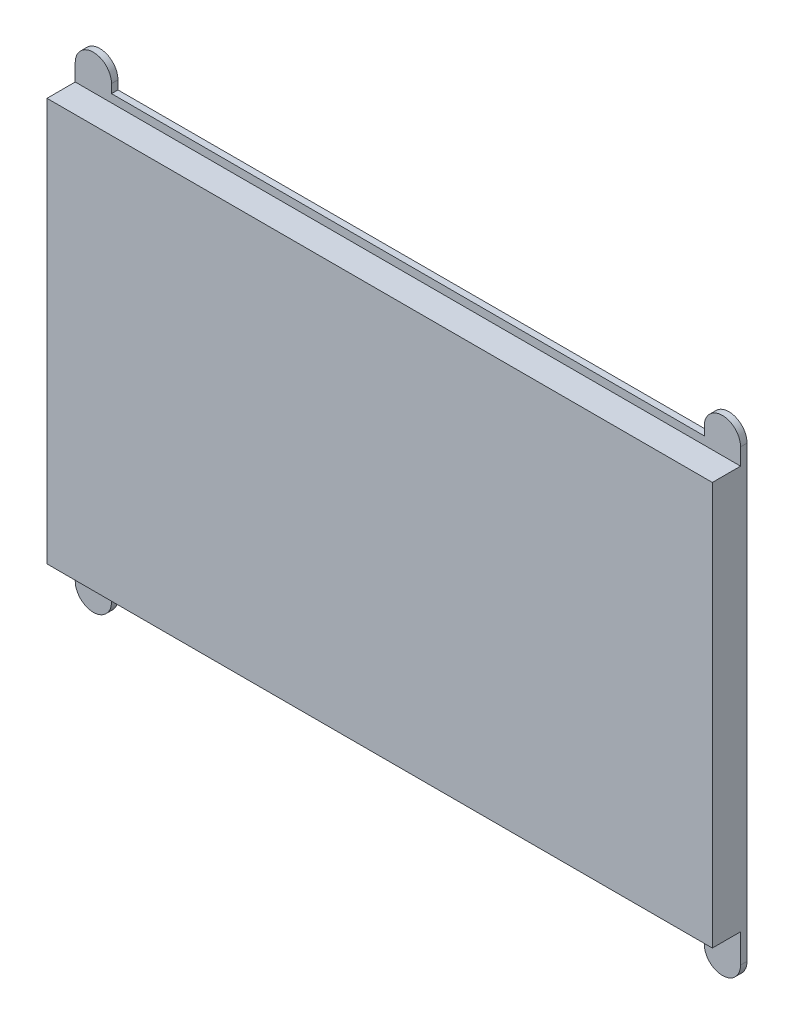
ISO-10303-21;
HEADER;
FILE_DESCRIPTION(('STEP AP214'),'2;1');
FILE_NAME('part.step','',(''),(''),'','','');
FILE_SCHEMA(('AUTOMOTIVE_DESIGN { 1 0 10303 214 1 1 1 1 }'));
ENDSEC;
DATA;
#1=APPLICATION_CONTEXT('core data for automotive mechanical design processes');
#2=APPLICATION_PROTOCOL_DEFINITION('international standard','automotive_design',2000,#1);
#3=PRODUCT_CONTEXT('',#1,'mechanical');
#4=PRODUCT('Part','Part','',(#3));
#5=PRODUCT_RELATED_PRODUCT_CATEGORY('part','',(#4));
#6=PRODUCT_DEFINITION_FORMATION('','',#4);
#7=PRODUCT_DEFINITION_CONTEXT('part definition',#1,'design');
#8=PRODUCT_DEFINITION('design','',#6,#7);
#9=PRODUCT_DEFINITION_SHAPE('','',#8);
#10=(LENGTH_UNIT() NAMED_UNIT(*) SI_UNIT(.MILLI.,.METRE.));
#11=(NAMED_UNIT(*) PLANE_ANGLE_UNIT() SI_UNIT($,.RADIAN.));
#12=(NAMED_UNIT(*) SI_UNIT($,.STERADIAN.) SOLID_ANGLE_UNIT());
#13=UNCERTAINTY_MEASURE_WITH_UNIT(LENGTH_MEASURE(1.E-05),#10,'distance_accuracy_value','');
#14=(GEOMETRIC_REPRESENTATION_CONTEXT(3) GLOBAL_UNCERTAINTY_ASSIGNED_CONTEXT((#13)) GLOBAL_UNIT_ASSIGNED_CONTEXT((#10,
#11,#12)) REPRESENTATION_CONTEXT('',''));
#15=CARTESIAN_POINT('',(0.,0.,0.));
#16=DIRECTION('',(0.,0.,1.));
#17=DIRECTION('',(1.,0.,0.));
#18=AXIS2_PLACEMENT_3D('',#15,#16,#17);
#19=CARTESIAN_POINT('',(-78.,-55.65,1.6));
#20=DIRECTION('',(0.,0.,1.));
#21=DIRECTION('',(1.,0.,0.));
#22=AXIS2_PLACEMENT_3D('',#19,#20,#21);
#23=PLANE('',#22);
#24=DIRECTION('',(-1.,0.,0.));
#25=VECTOR('',#24,1.);
#26=CARTESIAN_POINT('',(-82.5,51.5,1.6));
#27=LINE('',#26,#25);
#28=CARTESIAN_POINT('',(82.5,51.5,1.6));
#29=VERTEX_POINT('',#28);
#30=CARTESIAN_POINT('',(-82.5,51.5,1.6));
#31=VERTEX_POINT('',#30);
#32=EDGE_CURVE('E53',#29,#31,#27,.T.);
#33=ORIENTED_EDGE('',*,*,#32,.F.);
#34=DIRECTION('',(0.,1.,0.));
#35=VECTOR('',#34,1.);
#36=CARTESIAN_POINT('',(82.5,-55.65,1.6));
#37=LINE('',#36,#35);
#38=CARTESIAN_POINT('',(82.5,55.65,1.6));
#39=VERTEX_POINT('',#38);
#40=EDGE_CURVE('E194',#29,#39,#37,.T.);
#41=ORIENTED_EDGE('',*,*,#40,.T.);
#42=CARTESIAN_POINT('',(78.,55.65,1.6));
#43=DIRECTION('',(0.,0.,1.));
#44=DIRECTION('',(-1.,0.,0.));
#45=AXIS2_PLACEMENT_3D('',#42,#43,#44);
#46=CIRCLE('',#45,4.5);
#47=CARTESIAN_POINT('',(73.5,55.65,1.6));
#48=VERTEX_POINT('',#47);
#49=EDGE_CURVE('E197',#39,#48,#46,.T.);
#50=ORIENTED_EDGE('',*,*,#49,.T.);
#51=DIRECTION('',(0.,-1.,0.));
#52=VECTOR('',#51,1.);
#53=CARTESIAN_POINT('',(73.5,53.5,1.6));
#54=LINE('',#53,#52);
#55=CARTESIAN_POINT('',(73.5,53.5,1.6));
#56=VERTEX_POINT('',#55);
#57=EDGE_CURVE('E199',#48,#56,#54,.T.);
#58=ORIENTED_EDGE('',*,*,#57,.T.);
#59=DIRECTION('',(-1.,0.,0.));
#60=VECTOR('',#59,1.);
#61=CARTESIAN_POINT('',(-73.5,53.5,1.6));
#62=LINE('',#61,#60);
#63=CARTESIAN_POINT('',(-73.5,53.5,1.6));
#64=VERTEX_POINT('',#63);
#65=EDGE_CURVE('E201',#56,#64,#62,.T.);
#66=ORIENTED_EDGE('',*,*,#65,.T.);
#67=DIRECTION('',(0.,1.,0.));
#68=VECTOR('',#67,1.);
#69=CARTESIAN_POINT('',(-73.5,55.65,1.6));
#70=LINE('',#69,#68);
#71=CARTESIAN_POINT('',(-73.5,55.65,1.6));
#72=VERTEX_POINT('',#71);
#73=EDGE_CURVE('E203',#64,#72,#70,.T.);
#74=ORIENTED_EDGE('',*,*,#73,.T.);
#75=CARTESIAN_POINT('',(-78.,55.65,1.6));
#76=DIRECTION('',(0.,0.,1.));
#77=DIRECTION('',(-1.,0.,0.));
#78=AXIS2_PLACEMENT_3D('',#75,#76,#77);
#79=CIRCLE('',#78,4.5);
#80=CARTESIAN_POINT('',(-82.5,55.65,1.6));
#81=VERTEX_POINT('',#80);
#82=EDGE_CURVE('E205',#72,#81,#79,.T.);
#83=ORIENTED_EDGE('',*,*,#82,.T.);
#84=DIRECTION('',(0.,-1.,0.));
#85=VECTOR('',#84,1.);
#86=CARTESIAN_POINT('',(-82.5,53.5,1.6));
#87=LINE('',#86,#85);
#88=EDGE_CURVE('E182',#81,#31,#87,.T.);
#89=ORIENTED_EDGE('',*,*,#88,.T.);
#90=EDGE_LOOP('',(#33,#41,#50,#58,#66,#74,#83,#89));
#91=FACE_BOUND('',#90,.T.);
#92=ADVANCED_FACE('F38',(#91),#23,.T.);
#93=CARTESIAN_POINT('',(-78.,-55.65,1.6));
#94=DIRECTION('',(0.,0.,-1.));
#95=DIRECTION('',(-1.,0.,0.));
#96=AXIS2_PLACEMENT_3D('',#93,#94,#95);
#97=CYLINDRICAL_SURFACE('',#96,4.5);
#98=CARTESIAN_POINT('',(-78.,-55.65,0.));
#99=DIRECTION('',(0.,0.,1.));
#100=DIRECTION('',(1.,0.,0.));
#101=AXIS2_PLACEMENT_3D('',#98,#99,#100);
#102=CIRCLE('',#101,4.5);
#103=CARTESIAN_POINT('',(-82.5,-55.65,0.));
#104=VERTEX_POINT('',#103);
#105=CARTESIAN_POINT('',(-73.5,-55.65,0.));
#106=VERTEX_POINT('',#105);
#107=EDGE_CURVE('E174',#104,#106,#102,.T.);
#108=ORIENTED_EDGE('',*,*,#107,.T.);
#109=DIRECTION('',(0.,0.,-1.));
#110=VECTOR('',#109,1.);
#111=CARTESIAN_POINT('',(-73.5,-55.65,1.6));
#112=LINE('',#111,#110);
#113=CARTESIAN_POINT('',(-73.5,-55.65,1.6));
#114=VERTEX_POINT('',#113);
#115=EDGE_CURVE('E46',#114,#106,#112,.T.);
#116=ORIENTED_EDGE('',*,*,#115,.F.);
#117=CARTESIAN_POINT('',(-78.,-55.65,1.6));
#118=DIRECTION('',(0.,0.,1.));
#119=DIRECTION('',(1.,0.,0.));
#120=AXIS2_PLACEMENT_3D('',#117,#118,#119);
#121=CIRCLE('',#120,4.5);
#122=CARTESIAN_POINT('',(-82.5,-55.65,1.6));
#123=VERTEX_POINT('',#122);
#124=EDGE_CURVE('E184',#123,#114,#121,.T.);
#125=ORIENTED_EDGE('',*,*,#124,.F.);
#126=DIRECTION('',(0.,0.,-1.));
#127=VECTOR('',#126,1.);
#128=CARTESIAN_POINT('',(-82.5,-55.65,1.6));
#129=LINE('',#128,#127);
#130=EDGE_CURVE('E11',#123,#104,#129,.T.);
#131=ORIENTED_EDGE('',*,*,#130,.T.);
#132=EDGE_LOOP('',(#108,#116,#125,#131));
#133=FACE_BOUND('',#132,.T.);
#134=ADVANCED_FACE('F40',(#133),#97,.T.);
#135=CARTESIAN_POINT('',(-73.5,-55.65,1.6));
#136=DIRECTION('',(-1.,0.,0.));
#137=DIRECTION('',(0.,0.,1.));
#138=AXIS2_PLACEMENT_3D('',#135,#136,#137);
#139=PLANE('',#138);
#140=DIRECTION('',(0.,1.,0.));
#141=VECTOR('',#140,1.);
#142=CARTESIAN_POINT('',(-73.5,-55.65,0.));
#143=LINE('',#142,#141);
#144=CARTESIAN_POINT('',(-73.5,-53.5,0.));
#145=VERTEX_POINT('',#144);
#146=EDGE_CURVE('E176',#106,#145,#143,.T.);
#147=ORIENTED_EDGE('',*,*,#146,.T.);
#148=DIRECTION('',(0.,0.,-1.));
#149=VECTOR('',#148,1.);
#150=CARTESIAN_POINT('',(-73.5,-53.5,1.6));
#151=LINE('',#150,#149);
#152=CARTESIAN_POINT('',(-73.5,-53.5,1.6));
#153=VERTEX_POINT('',#152);
#154=EDGE_CURVE('E257',#153,#145,#151,.T.);
#155=ORIENTED_EDGE('',*,*,#154,.F.);
#156=DIRECTION('',(0.,1.,0.));
#157=VECTOR('',#156,1.);
#158=CARTESIAN_POINT('',(-73.5,-55.65,1.6));
#159=LINE('',#158,#157);
#160=EDGE_CURVE('E186',#114,#153,#159,.T.);
#161=ORIENTED_EDGE('',*,*,#160,.F.);
#162=ORIENTED_EDGE('',*,*,#115,.T.);
#163=EDGE_LOOP('',(#147,#155,#161,#162));
#164=FACE_BOUND('',#163,.T.);
#165=ADVANCED_FACE('F264',(#164),#139,.F.);
#166=CARTESIAN_POINT('',(-73.5,-53.5,1.6));
#167=DIRECTION('',(0.,1.,0.));
#168=DIRECTION('',(0.,0.,1.));
#169=AXIS2_PLACEMENT_3D('',#166,#167,#168);
#170=PLANE('',#169);
#171=DIRECTION('',(1.,0.,0.));
#172=VECTOR('',#171,1.);
#173=CARTESIAN_POINT('',(-73.5,-53.5,0.));
#174=LINE('',#173,#172);
#175=CARTESIAN_POINT('',(73.5,-53.5,0.));
#176=VERTEX_POINT('',#175);
#177=EDGE_CURVE('E210',#145,#176,#174,.T.);
#178=ORIENTED_EDGE('',*,*,#177,.T.);
#179=DIRECTION('',(0.,0.,-1.));
#180=VECTOR('',#179,1.);
#181=CARTESIAN_POINT('',(73.5,-53.5,1.6));
#182=LINE('',#181,#180);
#183=CARTESIAN_POINT('',(73.5,-53.5,1.6));
#184=VERTEX_POINT('',#183);
#185=EDGE_CURVE('E254',#184,#176,#182,.T.);
#186=ORIENTED_EDGE('',*,*,#185,.F.);
#187=DIRECTION('',(1.,0.,0.));
#188=VECTOR('',#187,1.);
#189=CARTESIAN_POINT('',(-73.5,-53.5,1.6));
#190=LINE('',#189,#188);
#191=EDGE_CURVE('E188',#153,#184,#190,.T.);
#192=ORIENTED_EDGE('',*,*,#191,.F.);
#193=ORIENTED_EDGE('',*,*,#154,.T.);
#194=EDGE_LOOP('',(#178,#186,#192,#193));
#195=FACE_BOUND('',#194,.T.);
#196=ADVANCED_FACE('F277',(#195),#170,.F.);
#197=CARTESIAN_POINT('',(73.5,-53.5,1.6));
#198=DIRECTION('',(1.,0.,0.));
#199=DIRECTION('',(0.,0.,-1.));
#200=AXIS2_PLACEMENT_3D('',#197,#198,#199);
#201=PLANE('',#200);
#202=DIRECTION('',(0.,-1.,0.));
#203=VECTOR('',#202,1.);
#204=CARTESIAN_POINT('',(73.5,-53.5,0.));
#205=LINE('',#204,#203);
#206=CARTESIAN_POINT('',(73.5,-55.65,0.));
#207=VERTEX_POINT('',#206);
#208=EDGE_CURVE('E212',#176,#207,#205,.T.);
#209=ORIENTED_EDGE('',*,*,#208,.T.);
#210=DIRECTION('',(0.,0.,-1.));
#211=VECTOR('',#210,1.);
#212=CARTESIAN_POINT('',(73.5,-55.65,1.6));
#213=LINE('',#212,#211);
#214=CARTESIAN_POINT('',(73.5,-55.65,1.6));
#215=VERTEX_POINT('',#214);
#216=EDGE_CURVE('E251',#215,#207,#213,.T.);
#217=ORIENTED_EDGE('',*,*,#216,.F.);
#218=DIRECTION('',(0.,-1.,0.));
#219=VECTOR('',#218,1.);
#220=CARTESIAN_POINT('',(73.5,-53.5,1.6));
#221=LINE('',#220,#219);
#222=EDGE_CURVE('E190',#184,#215,#221,.T.);
#223=ORIENTED_EDGE('',*,*,#222,.F.);
#224=ORIENTED_EDGE('',*,*,#185,.T.);
#225=EDGE_LOOP('',(#209,#217,#223,#224));
#226=FACE_BOUND('',#225,.T.);
#227=ADVANCED_FACE('F281',(#226),#201,.F.);
#228=CARTESIAN_POINT('',(78.,-55.65,1.6));
#229=DIRECTION('',(0.,0.,-1.));
#230=DIRECTION('',(-1.,0.,0.));
#231=AXIS2_PLACEMENT_3D('',#228,#229,#230);
#232=CYLINDRICAL_SURFACE('',#231,4.5);
#233=CARTESIAN_POINT('',(78.,-55.65,0.));
#234=DIRECTION('',(0.,0.,1.));
#235=DIRECTION('',(1.,0.,0.));
#236=AXIS2_PLACEMENT_3D('',#233,#234,#235);
#237=CIRCLE('',#236,4.5);
#238=CARTESIAN_POINT('',(82.5,-55.65,0.));
#239=VERTEX_POINT('',#238);
#240=EDGE_CURVE('E214',#207,#239,#237,.T.);
#241=ORIENTED_EDGE('',*,*,#240,.T.);
#242=DIRECTION('',(0.,0.,-1.));
#243=VECTOR('',#242,1.);
#244=CARTESIAN_POINT('',(82.5,-55.65,1.6));
#245=LINE('',#244,#243);
#246=CARTESIAN_POINT('',(82.5,-55.65,1.6));
#247=VERTEX_POINT('',#246);
#248=EDGE_CURVE('E248',#247,#239,#245,.T.);
#249=ORIENTED_EDGE('',*,*,#248,.F.);
#250=CARTESIAN_POINT('',(78.,-55.65,1.6));
#251=DIRECTION('',(0.,0.,1.));
#252=DIRECTION('',(1.,0.,0.));
#253=AXIS2_PLACEMENT_3D('',#250,#251,#252);
#254=CIRCLE('',#253,4.5);
#255=EDGE_CURVE('E192',#215,#247,#254,.T.);
#256=ORIENTED_EDGE('',*,*,#255,.F.);
#257=ORIENTED_EDGE('',*,*,#216,.T.);
#258=EDGE_LOOP('',(#241,#249,#256,#257));
#259=FACE_BOUND('',#258,.T.);
#260=ADVANCED_FACE('F318',(#259),#232,.T.);
#261=CARTESIAN_POINT('',(82.5,55.65,1.6));
#262=DIRECTION('',(-1.,0.,0.));
#263=DIRECTION('',(0.,0.,1.));
#264=AXIS2_PLACEMENT_3D('',#261,#262,#263);
#265=PLANE('',#264);
#266=DIRECTION('',(0.,1.,0.));
#267=VECTOR('',#266,1.);
#268=CARTESIAN_POINT('',(82.5,55.65,0.));
#269=LINE('',#268,#267);
#270=CARTESIAN_POINT('',(82.5,55.65,0.));
#271=VERTEX_POINT('',#270);
#272=EDGE_CURVE('E217',#239,#271,#269,.T.);
#273=ORIENTED_EDGE('',*,*,#272,.T.);
#274=DIRECTION('',(0.,0.,-1.));
#275=VECTOR('',#274,1.);
#276=CARTESIAN_POINT('',(82.5,55.65,1.6));
#277=LINE('',#276,#275);
#278=EDGE_CURVE('E245',#39,#271,#277,.T.);
#279=ORIENTED_EDGE('',*,*,#278,.F.);
#280=ORIENTED_EDGE('',*,*,#40,.F.);
#281=DIRECTION('',(0.,0.,-1.));
#282=VECTOR('',#281,1.);
#283=CARTESIAN_POINT('',(82.5,51.5,8.6));
#284=LINE('',#283,#282);
#285=CARTESIAN_POINT('',(82.5,51.5,8.6));
#286=VERTEX_POINT('',#285);
#287=EDGE_CURVE('E178',#286,#29,#284,.T.);
#288=ORIENTED_EDGE('',*,*,#287,.F.);
#289=DIRECTION('',(0.,1.,0.));
#290=VECTOR('',#289,1.);
#291=CARTESIAN_POINT('',(82.5,51.5,8.6));
#292=LINE('',#291,#290);
#293=CARTESIAN_POINT('',(82.5,-48.5,8.6));
#294=VERTEX_POINT('',#293);
#295=EDGE_CURVE('E160',#294,#286,#292,.T.);
#296=ORIENTED_EDGE('',*,*,#295,.F.);
#297=DIRECTION('',(0.,0.,-1.));
#298=VECTOR('',#297,1.);
#299=CARTESIAN_POINT('',(82.5,-48.5,8.6));
#300=LINE('',#299,#298);
#301=CARTESIAN_POINT('',(82.5,-48.5,1.6));
#302=VERTEX_POINT('',#301);
#303=EDGE_CURVE('E157',#294,#302,#300,.T.);
#304=ORIENTED_EDGE('',*,*,#303,.T.);
#305=EDGE_CURVE('E195',#247,#302,#37,.T.);
#306=ORIENTED_EDGE('',*,*,#305,.F.);
#307=ORIENTED_EDGE('',*,*,#248,.T.);
#308=EDGE_LOOP('',(#273,#279,#280,#288,#296,#304,#306,#307));
#309=FACE_BOUND('',#308,.T.);
#310=ADVANCED_FACE('F313',(#309),#265,.F.);
#311=CARTESIAN_POINT('',(78.,55.65,1.6));
#312=DIRECTION('',(0.,0.,-1.));
#313=DIRECTION('',(-1.,0.,0.));
#314=AXIS2_PLACEMENT_3D('',#311,#312,#313);
#315=CYLINDRICAL_SURFACE('',#314,4.5);
#316=CARTESIAN_POINT('',(78.,55.65,0.));
#317=DIRECTION('',(0.,0.,1.));
#318=DIRECTION('',(-1.,0.,0.));
#319=AXIS2_PLACEMENT_3D('',#316,#317,#318);
#320=CIRCLE('',#319,4.5);
#321=CARTESIAN_POINT('',(73.5,55.65,0.));
#322=VERTEX_POINT('',#321);
#323=EDGE_CURVE('E219',#271,#322,#320,.T.);
#324=ORIENTED_EDGE('',*,*,#323,.T.);
#325=DIRECTION('',(0.,0.,-1.));
#326=VECTOR('',#325,1.);
#327=CARTESIAN_POINT('',(73.5,55.65,1.6));
#328=LINE('',#327,#326);
#329=EDGE_CURVE('E242',#48,#322,#328,.T.);
#330=ORIENTED_EDGE('',*,*,#329,.F.);
#331=ORIENTED_EDGE('',*,*,#49,.F.);
#332=ORIENTED_EDGE('',*,*,#278,.T.);
#333=EDGE_LOOP('',(#324,#330,#331,#332));
#334=FACE_BOUND('',#333,.T.);
#335=ADVANCED_FACE('F310',(#334),#315,.T.);
#336=CARTESIAN_POINT('',(73.5,53.5,1.6));
#337=DIRECTION('',(1.,0.,0.));
#338=DIRECTION('',(0.,0.,-1.));
#339=AXIS2_PLACEMENT_3D('',#336,#337,#338);
#340=PLANE('',#339);
#341=DIRECTION('',(0.,-1.,0.));
#342=VECTOR('',#341,1.);
#343=CARTESIAN_POINT('',(73.5,53.5,0.));
#344=LINE('',#343,#342);
#345=CARTESIAN_POINT('',(73.5,53.5,0.));
#346=VERTEX_POINT('',#345);
#347=EDGE_CURVE('E221',#322,#346,#344,.T.);
#348=ORIENTED_EDGE('',*,*,#347,.T.);
#349=DIRECTION('',(0.,0.,-1.));
#350=VECTOR('',#349,1.);
#351=CARTESIAN_POINT('',(73.5,53.5,1.6));
#352=LINE('',#351,#350);
#353=EDGE_CURVE('E239',#56,#346,#352,.T.);
#354=ORIENTED_EDGE('',*,*,#353,.F.);
#355=ORIENTED_EDGE('',*,*,#57,.F.);
#356=ORIENTED_EDGE('',*,*,#329,.T.);
#357=EDGE_LOOP('',(#348,#354,#355,#356));
#358=FACE_BOUND('',#357,.T.);
#359=ADVANCED_FACE('F305',(#358),#340,.F.);
#360=CARTESIAN_POINT('',(-73.5,53.5,1.6));
#361=DIRECTION('',(0.,-1.,0.));
#362=DIRECTION('',(0.,0.,-1.));
#363=AXIS2_PLACEMENT_3D('',#360,#361,#362);
#364=PLANE('',#363);
#365=DIRECTION('',(-1.,0.,0.));
#366=VECTOR('',#365,1.);
#367=CARTESIAN_POINT('',(-73.5,53.5,0.));
#368=LINE('',#367,#366);
#369=CARTESIAN_POINT('',(-73.5,53.5,0.));
#370=VERTEX_POINT('',#369);
#371=EDGE_CURVE('E223',#346,#370,#368,.T.);
#372=ORIENTED_EDGE('',*,*,#371,.T.);
#373=DIRECTION('',(0.,0.,-1.));
#374=VECTOR('',#373,1.);
#375=CARTESIAN_POINT('',(-73.5,53.5,1.6));
#376=LINE('',#375,#374);
#377=EDGE_CURVE('E236',#64,#370,#376,.T.);
#378=ORIENTED_EDGE('',*,*,#377,.F.);
#379=ORIENTED_EDGE('',*,*,#65,.F.);
#380=ORIENTED_EDGE('',*,*,#353,.T.);
#381=EDGE_LOOP('',(#372,#378,#379,#380));
#382=FACE_BOUND('',#381,.T.);
#383=ADVANCED_FACE('F300',(#382),#364,.F.);
#384=CARTESIAN_POINT('',(-73.5,55.65,1.6));
#385=DIRECTION('',(-1.,0.,0.));
#386=DIRECTION('',(0.,0.,1.));
#387=AXIS2_PLACEMENT_3D('',#384,#385,#386);
#388=PLANE('',#387);
#389=DIRECTION('',(0.,1.,0.));
#390=VECTOR('',#389,1.);
#391=CARTESIAN_POINT('',(-73.5,55.65,0.));
#392=LINE('',#391,#390);
#393=CARTESIAN_POINT('',(-73.5,55.65,0.));
#394=VERTEX_POINT('',#393);
#395=EDGE_CURVE('E225',#370,#394,#392,.T.);
#396=ORIENTED_EDGE('',*,*,#395,.T.);
#397=DIRECTION('',(0.,0.,-1.));
#398=VECTOR('',#397,1.);
#399=CARTESIAN_POINT('',(-73.5,55.65,1.6));
#400=LINE('',#399,#398);
#401=EDGE_CURVE('E233',#72,#394,#400,.T.);
#402=ORIENTED_EDGE('',*,*,#401,.F.);
#403=ORIENTED_EDGE('',*,*,#73,.F.);
#404=ORIENTED_EDGE('',*,*,#377,.T.);
#405=EDGE_LOOP('',(#396,#402,#403,#404));
#406=FACE_BOUND('',#405,.T.);
#407=ADVANCED_FACE('F296',(#406),#388,.F.);
#408=CARTESIAN_POINT('',(-78.,55.65,1.6));
#409=DIRECTION('',(0.,0.,-1.));
#410=DIRECTION('',(-1.,0.,0.));
#411=AXIS2_PLACEMENT_3D('',#408,#409,#410);
#412=CYLINDRICAL_SURFACE('',#411,4.5);
#413=CARTESIAN_POINT('',(-78.,55.65,0.));
#414=DIRECTION('',(0.,0.,1.));
#415=DIRECTION('',(-1.,0.,0.));
#416=AXIS2_PLACEMENT_3D('',#413,#414,#415);
#417=CIRCLE('',#416,4.5);
#418=CARTESIAN_POINT('',(-82.5,55.65,0.));
#419=VERTEX_POINT('',#418);
#420=EDGE_CURVE('E227',#394,#419,#417,.T.);
#421=ORIENTED_EDGE('',*,*,#420,.T.);
#422=DIRECTION('',(0.,0.,-1.));
#423=VECTOR('',#422,1.);
#424=CARTESIAN_POINT('',(-82.5,55.65,1.6));
#425=LINE('',#424,#423);
#426=EDGE_CURVE('E207',#81,#419,#425,.T.);
#427=ORIENTED_EDGE('',*,*,#426,.F.);
#428=ORIENTED_EDGE('',*,*,#82,.F.);
#429=ORIENTED_EDGE('',*,*,#401,.T.);
#430=EDGE_LOOP('',(#421,#427,#428,#429));
#431=FACE_BOUND('',#430,.T.);
#432=ADVANCED_FACE('F291',(#431),#412,.T.);
#433=CARTESIAN_POINT('',(-82.5,53.5,1.6));
#434=DIRECTION('',(1.,0.,0.));
#435=DIRECTION('',(0.,0.,-1.));
#436=AXIS2_PLACEMENT_3D('',#433,#434,#435);
#437=PLANE('',#436);
#438=DIRECTION('',(0.,-1.,0.));
#439=VECTOR('',#438,1.);
#440=CARTESIAN_POINT('',(-82.5,53.5,0.));
#441=LINE('',#440,#439);
#442=EDGE_CURVE('E229',#419,#104,#441,.T.);
#443=ORIENTED_EDGE('',*,*,#442,.T.);
#444=ORIENTED_EDGE('',*,*,#130,.F.);
#445=CARTESIAN_POINT('',(-82.5,-48.5,1.6));
#446=VERTEX_POINT('',#445);
#447=EDGE_CURVE('E173',#446,#123,#87,.T.);
#448=ORIENTED_EDGE('',*,*,#447,.F.);
#449=DIRECTION('',(0.,0.,-1.));
#450=VECTOR('',#449,1.);
#451=CARTESIAN_POINT('',(-82.5,-48.5,8.6));
#452=LINE('',#451,#450);
#453=CARTESIAN_POINT('',(-82.5,-48.5,8.6));
#454=VERTEX_POINT('',#453);
#455=EDGE_CURVE('E155',#454,#446,#452,.T.);
#456=ORIENTED_EDGE('',*,*,#455,.F.);
#457=DIRECTION('',(0.,-1.,0.));
#458=VECTOR('',#457,1.);
#459=CARTESIAN_POINT('',(-82.5,51.5,8.6));
#460=LINE('',#459,#458);
#461=CARTESIAN_POINT('',(-82.5,51.5,8.6));
#462=VERTEX_POINT('',#461);
#463=EDGE_CURVE('E161',#462,#454,#460,.T.);
#464=ORIENTED_EDGE('',*,*,#463,.F.);
#465=DIRECTION('',(0.,0.,-1.));
#466=VECTOR('',#465,1.);
#467=CARTESIAN_POINT('',(-82.5,51.5,8.6));
#468=LINE('',#467,#466);
#469=EDGE_CURVE('E324',#462,#31,#468,.T.);
#470=ORIENTED_EDGE('',*,*,#469,.T.);
#471=ORIENTED_EDGE('',*,*,#88,.F.);
#472=ORIENTED_EDGE('',*,*,#426,.T.);
#473=EDGE_LOOP('',(#443,#444,#448,#456,#464,#470,#471,#472));
#474=FACE_BOUND('',#473,.T.);
#475=ADVANCED_FACE('F171',(#474),#437,.F.);
#476=DIRECTION('',(1.,0.,0.));
#477=VECTOR('',#476,1.);
#478=CARTESIAN_POINT('',(-82.5,-48.5,1.6));
#479=LINE('',#478,#477);
#480=EDGE_CURVE('E61',#446,#302,#479,.T.);
#481=ORIENTED_EDGE('',*,*,#480,.F.);
#482=ORIENTED_EDGE('',*,*,#447,.T.);
#483=ORIENTED_EDGE('',*,*,#124,.T.);
#484=ORIENTED_EDGE('',*,*,#160,.T.);
#485=ORIENTED_EDGE('',*,*,#191,.T.);
#486=ORIENTED_EDGE('',*,*,#222,.T.);
#487=ORIENTED_EDGE('',*,*,#255,.T.);
#488=ORIENTED_EDGE('',*,*,#305,.T.);
#489=EDGE_LOOP('',(#481,#482,#483,#484,#485,#486,#487,#488));
#490=FACE_BOUND('',#489,.T.);
#491=ADVANCED_FACE('F284',(#490),#23,.T.);
#492=CARTESIAN_POINT('',(-78.,-55.65,0.));
#493=DIRECTION('',(0.,0.,1.));
#494=DIRECTION('',(1.,0.,0.));
#495=AXIS2_PLACEMENT_3D('',#492,#493,#494);
#496=PLANE('',#495);
#497=ORIENTED_EDGE('',*,*,#107,.F.);
#498=ORIENTED_EDGE('',*,*,#442,.F.);
#499=ORIENTED_EDGE('',*,*,#420,.F.);
#500=ORIENTED_EDGE('',*,*,#395,.F.);
#501=ORIENTED_EDGE('',*,*,#371,.F.);
#502=ORIENTED_EDGE('',*,*,#347,.F.);
#503=ORIENTED_EDGE('',*,*,#323,.F.);
#504=ORIENTED_EDGE('',*,*,#272,.F.);
#505=ORIENTED_EDGE('',*,*,#240,.F.);
#506=ORIENTED_EDGE('',*,*,#208,.F.);
#507=ORIENTED_EDGE('',*,*,#177,.F.);
#508=ORIENTED_EDGE('',*,*,#146,.F.);
#509=EDGE_LOOP('',(#497,#498,#499,#500,#501,#502,#503,#504,#505,#506,#507,#508));
#510=FACE_BOUND('',#509,.T.);
#511=ADVANCED_FACE('F271',(#510),#496,.F.);
#512=CARTESIAN_POINT('',(-82.5,-48.5,8.6));
#513=DIRECTION('',(0.,1.,0.));
#514=DIRECTION('',(0.,0.,1.));
#515=AXIS2_PLACEMENT_3D('',#512,#513,#514);
#516=PLANE('',#515);
#517=ORIENTED_EDGE('',*,*,#480,.T.);
#518=ORIENTED_EDGE('',*,*,#303,.F.);
#519=DIRECTION('',(1.,0.,0.));
#520=VECTOR('',#519,1.);
#521=CARTESIAN_POINT('',(-82.5,-48.5,8.6));
#522=LINE('',#521,#520);
#523=EDGE_CURVE('E151',#454,#294,#522,.T.);
#524=ORIENTED_EDGE('',*,*,#523,.F.);
#525=ORIENTED_EDGE('',*,*,#455,.T.);
#526=EDGE_LOOP('',(#517,#518,#524,#525));
#527=FACE_BOUND('',#526,.T.);
#528=ADVANCED_FACE('F153',(#527),#516,.F.);
#529=CARTESIAN_POINT('',(-82.5,51.5,8.6));
#530=DIRECTION('',(0.,-1.,0.));
#531=DIRECTION('',(1.,0.,0.));
#532=AXIS2_PLACEMENT_3D('',#529,#530,#531);
#533=PLANE('',#532);
#534=ORIENTED_EDGE('',*,*,#32,.T.);
#535=ORIENTED_EDGE('',*,*,#469,.F.);
#536=DIRECTION('',(-1.,0.,0.));
#537=VECTOR('',#536,1.);
#538=CARTESIAN_POINT('',(-82.5,51.5,8.6));
#539=LINE('',#538,#537);
#540=EDGE_CURVE('E166',#286,#462,#539,.T.);
#541=ORIENTED_EDGE('',*,*,#540,.F.);
#542=ORIENTED_EDGE('',*,*,#287,.T.);
#543=EDGE_LOOP('',(#534,#535,#541,#542));
#544=FACE_BOUND('',#543,.T.);
#545=ADVANCED_FACE('F326',(#544),#533,.F.);
#546=CARTESIAN_POINT('',(0.,0.,8.6));
#547=DIRECTION('',(0.,0.,1.));
#548=DIRECTION('',(1.,0.,0.));
#549=AXIS2_PLACEMENT_3D('',#546,#547,#548);
#550=PLANE('',#549);
#551=ORIENTED_EDGE('',*,*,#463,.T.);
#552=ORIENTED_EDGE('',*,*,#523,.T.);
#553=ORIENTED_EDGE('',*,*,#295,.T.);
#554=ORIENTED_EDGE('',*,*,#540,.T.);
#555=EDGE_LOOP('',(#551,#552,#553,#554));
#556=FACE_BOUND('',#555,.T.);
#557=ADVANCED_FACE('F164',(#556),#550,.T.);
#558=CLOSED_SHELL('',(#92,#134,#165,#196,#227,#260,#310,#335,#359,#383,#407,#432,#475,#491,#511,
#528,#545,#557));
#559=MANIFOLD_SOLID_BREP('B2',#558);
#560=ADVANCED_BREP_SHAPE_REPRESENTATION('',(#18,#559),#14);
#561=SHAPE_DEFINITION_REPRESENTATION(#9,#560);
ENDSEC;
END-ISO-10303-21;
